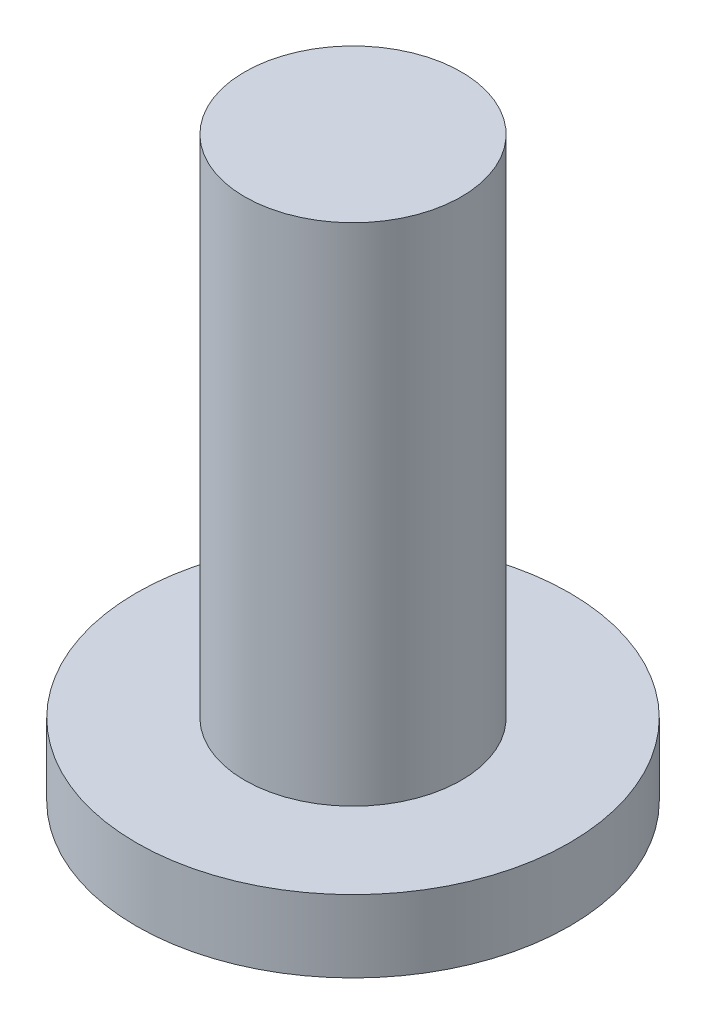
ISO-10303-21;
HEADER;
FILE_DESCRIPTION(('STEP AP214'),'2;1');
FILE_NAME('part.step','',(''),(''),'','','');
FILE_SCHEMA(('AUTOMOTIVE_DESIGN { 1 0 10303 214 1 1 1 1 }'));
ENDSEC;
DATA;
#1=APPLICATION_CONTEXT('core data for automotive mechanical design processes');
#2=APPLICATION_PROTOCOL_DEFINITION('international standard','automotive_design',2000,#1);
#3=PRODUCT_CONTEXT('',#1,'mechanical');
#4=PRODUCT('Part','Part','',(#3));
#5=PRODUCT_RELATED_PRODUCT_CATEGORY('part','',(#4));
#6=PRODUCT_DEFINITION_FORMATION('','',#4);
#7=PRODUCT_DEFINITION_CONTEXT('part definition',#1,'design');
#8=PRODUCT_DEFINITION('design','',#6,#7);
#9=PRODUCT_DEFINITION_SHAPE('','',#8);
#10=(LENGTH_UNIT() NAMED_UNIT(*) SI_UNIT(.MILLI.,.METRE.));
#11=(NAMED_UNIT(*) PLANE_ANGLE_UNIT() SI_UNIT($,.RADIAN.));
#12=(NAMED_UNIT(*) SI_UNIT($,.STERADIAN.) SOLID_ANGLE_UNIT());
#13=UNCERTAINTY_MEASURE_WITH_UNIT(LENGTH_MEASURE(1.E-05),#10,'distance_accuracy_value','');
#14=(GEOMETRIC_REPRESENTATION_CONTEXT(3) GLOBAL_UNCERTAINTY_ASSIGNED_CONTEXT((#13)) GLOBAL_UNIT_ASSIGNED_CONTEXT((#10,
#11,#12)) REPRESENTATION_CONTEXT('',''));
#15=CARTESIAN_POINT('',(0.,0.,0.));
#16=DIRECTION('',(0.,0.,1.));
#17=DIRECTION('',(1.,0.,0.));
#18=AXIS2_PLACEMENT_3D('',#15,#16,#17);
#19=CARTESIAN_POINT('',(0.,50.,0.));
#20=DIRECTION('',(0.,-1.,0.));
#21=DIRECTION('',(0.,0.,-1.));
#22=AXIS2_PLACEMENT_3D('',#19,#20,#21);
#23=CYLINDRICAL_SURFACE('',#22,150.);
#24=CARTESIAN_POINT('',(0.,50.,0.));
#25=DIRECTION('',(0.,1.,0.));
#26=DIRECTION('',(0.,0.,1.));
#27=AXIS2_PLACEMENT_3D('',#24,#25,#26);
#28=CIRCLE('',#27,150.);
#29=CARTESIAN_POINT('',(0.,50.,150.));
#30=VERTEX_POINT('',#29);
#31=EDGE_CURVE('E49',#30,#30,#28,.T.);
#32=ORIENTED_EDGE('',*,*,#31,.F.);
#33=EDGE_LOOP('',(#32));
#34=FACE_BOUND('',#33,.T.);
#35=CARTESIAN_POINT('',(0.,0.,0.));
#36=DIRECTION('',(0.,1.,0.));
#37=DIRECTION('',(0.,0.,1.));
#38=AXIS2_PLACEMENT_3D('',#35,#36,#37);
#39=CIRCLE('',#38,150.);
#40=CARTESIAN_POINT('',(0.,0.,150.));
#41=VERTEX_POINT('',#40);
#42=EDGE_CURVE('E44',#41,#41,#39,.T.);
#43=ORIENTED_EDGE('',*,*,#42,.T.);
#44=EDGE_LOOP('',(#43));
#45=FACE_BOUND('',#44,.T.);
#46=ADVANCED_FACE('F41',(#34,#45),#23,.T.);
#47=CARTESIAN_POINT('',(0.,50.,0.));
#48=DIRECTION('',(0.,1.,0.));
#49=DIRECTION('',(0.,0.,1.));
#50=AXIS2_PLACEMENT_3D('',#47,#48,#49);
#51=PLANE('',#50);
#52=CARTESIAN_POINT('',(0.,50.,0.));
#53=DIRECTION('',(0.,1.,0.));
#54=DIRECTION('',(0.,0.,1.));
#55=AXIS2_PLACEMENT_3D('',#52,#53,#54);
#56=CIRCLE('',#55,75.);
#57=CARTESIAN_POINT('',(0.,50.,75.));
#58=VERTEX_POINT('',#57);
#59=EDGE_CURVE('E10',#58,#58,#56,.T.);
#60=ORIENTED_EDGE('',*,*,#59,.F.);
#61=EDGE_LOOP('',(#60));
#62=FACE_BOUND('',#61,.T.);
#63=ORIENTED_EDGE('',*,*,#31,.T.);
#64=EDGE_LOOP('',(#63));
#65=FACE_BOUND('',#64,.T.);
#66=ADVANCED_FACE('F69',(#62,#65),#51,.T.);
#67=CARTESIAN_POINT('',(0.,0.,0.));
#68=DIRECTION('',(0.,1.,0.));
#69=DIRECTION('',(0.,0.,1.));
#70=AXIS2_PLACEMENT_3D('',#67,#68,#69);
#71=PLANE('',#70);
#72=ORIENTED_EDGE('',*,*,#42,.F.);
#73=EDGE_LOOP('',(#72));
#74=FACE_BOUND('',#73,.T.);
#75=ADVANCED_FACE('F66',(#74),#71,.F.);
#76=CARTESIAN_POINT('',(0.,400.,0.));
#77=DIRECTION('',(0.,-1.,0.));
#78=DIRECTION('',(0.,0.,-1.));
#79=AXIS2_PLACEMENT_3D('',#76,#77,#78);
#80=CYLINDRICAL_SURFACE('',#79,75.);
#81=CARTESIAN_POINT('',(0.,400.,0.));
#82=DIRECTION('',(0.,1.,0.));
#83=DIRECTION('',(0.,0.,1.));
#84=AXIS2_PLACEMENT_3D('',#81,#82,#83);
#85=CIRCLE('',#84,75.);
#86=CARTESIAN_POINT('',(0.,400.,75.));
#87=VERTEX_POINT('',#86);
#88=EDGE_CURVE('E56',#87,#87,#85,.T.);
#89=ORIENTED_EDGE('',*,*,#88,.F.);
#90=EDGE_LOOP('',(#89));
#91=FACE_BOUND('',#90,.T.);
#92=ORIENTED_EDGE('',*,*,#59,.T.);
#93=EDGE_LOOP('',(#92));
#94=FACE_BOUND('',#93,.T.);
#95=ADVANCED_FACE('F68',(#91,#94),#80,.T.);
#96=CARTESIAN_POINT('',(0.,400.,0.));
#97=DIRECTION('',(0.,1.,0.));
#98=DIRECTION('',(0.,0.,1.));
#99=AXIS2_PLACEMENT_3D('',#96,#97,#98);
#100=PLANE('',#99);
#101=ORIENTED_EDGE('',*,*,#88,.T.);
#102=EDGE_LOOP('',(#101));
#103=FACE_BOUND('',#102,.T.);
#104=ADVANCED_FACE('F74',(#103),#100,.T.);
#105=CLOSED_SHELL('',(#46,#66,#75,#95,#104));
#106=MANIFOLD_SOLID_BREP('B2',#105);
#107=ADVANCED_BREP_SHAPE_REPRESENTATION('',(#18,#106),#14);
#108=SHAPE_DEFINITION_REPRESENTATION(#9,#107);
ENDSEC;
END-ISO-10303-21;
